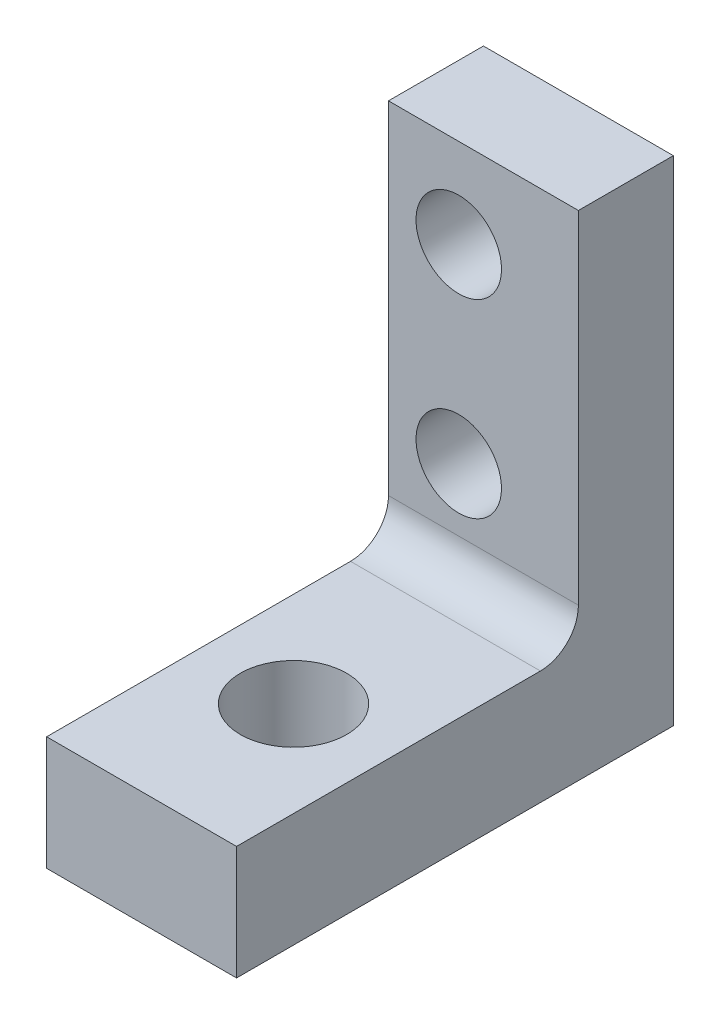
ISO-10303-21;
HEADER;
FILE_DESCRIPTION(('STEP AP214'),'2;1');
FILE_NAME('part.step','',(''),(''),'','','');
FILE_SCHEMA(('AUTOMOTIVE_DESIGN { 1 0 10303 214 1 1 1 1 }'));
ENDSEC;
DATA;
#1=APPLICATION_CONTEXT('core data for automotive mechanical design processes');
#2=APPLICATION_PROTOCOL_DEFINITION('international standard','automotive_design',2000,#1);
#3=PRODUCT_CONTEXT('',#1,'mechanical');
#4=PRODUCT('Part','Part','',(#3));
#5=PRODUCT_RELATED_PRODUCT_CATEGORY('part','',(#4));
#6=PRODUCT_DEFINITION_FORMATION('','',#4);
#7=PRODUCT_DEFINITION_CONTEXT('part definition',#1,'design');
#8=PRODUCT_DEFINITION('design','',#6,#7);
#9=PRODUCT_DEFINITION_SHAPE('','',#8);
#10=(LENGTH_UNIT() NAMED_UNIT(*) SI_UNIT(.MILLI.,.METRE.));
#11=(NAMED_UNIT(*) PLANE_ANGLE_UNIT() SI_UNIT($,.RADIAN.));
#12=(NAMED_UNIT(*) SI_UNIT($,.STERADIAN.) SOLID_ANGLE_UNIT());
#13=UNCERTAINTY_MEASURE_WITH_UNIT(LENGTH_MEASURE(1.E-05),#10,'distance_accuracy_value','');
#14=(GEOMETRIC_REPRESENTATION_CONTEXT(3) GLOBAL_UNCERTAINTY_ASSIGNED_CONTEXT((#13)) GLOBAL_UNIT_ASSIGNED_CONTEXT((#10,
#11,#12)) REPRESENTATION_CONTEXT('',''));
#15=CARTESIAN_POINT('',(0.,0.,0.));
#16=DIRECTION('',(0.,0.,1.));
#17=DIRECTION('',(1.,0.,0.));
#18=AXIS2_PLACEMENT_3D('',#15,#16,#17);
#19=CARTESIAN_POINT('',(0.,6.,0.));
#20=DIRECTION('',(0.,1.,0.));
#21=DIRECTION('',(0.,0.,1.));
#22=AXIS2_PLACEMENT_3D('',#19,#20,#21);
#23=PLANE('',#22);
#24=DIRECTION('',(0.,0.,-1.));
#25=VECTOR('',#24,1.);
#26=CARTESIAN_POINT('',(5.,6.,8.));
#27=LINE('',#26,#25);
#28=CARTESIAN_POINT('',(5.,6.,8.));
#29=VERTEX_POINT('',#28);
#30=CARTESIAN_POINT('',(5.,6.,-8.));
#31=VERTEX_POINT('',#30);
#32=EDGE_CURVE('E153',#29,#31,#27,.T.);
#33=ORIENTED_EDGE('',*,*,#32,.T.);
#34=DIRECTION('',(1.,0.,0.));
#35=VECTOR('',#34,1.);
#36=CARTESIAN_POINT('',(0.,6.,-8.));
#37=LINE('',#36,#35);
#38=CARTESIAN_POINT('',(-5.,6.,-8.));
#39=VERTEX_POINT('',#38);
#40=EDGE_CURVE('E75',#31,#39,#37,.F.);
#41=ORIENTED_EDGE('',*,*,#40,.T.);
#42=DIRECTION('',(0.,0.,1.));
#43=VECTOR('',#42,1.);
#44=CARTESIAN_POINT('',(-5.,6.,-15.));
#45=LINE('',#44,#43);
#46=CARTESIAN_POINT('',(-5.,6.,8.));
#47=VERTEX_POINT('',#46);
#48=EDGE_CURVE('E148',#39,#47,#45,.T.);
#49=ORIENTED_EDGE('',*,*,#48,.T.);
#50=DIRECTION('',(1.,0.,0.));
#51=VECTOR('',#50,1.);
#52=CARTESIAN_POINT('',(-5.,6.,8.));
#53=LINE('',#52,#51);
#54=EDGE_CURVE('E150',#47,#29,#53,.T.);
#55=ORIENTED_EDGE('',*,*,#54,.T.);
#56=EDGE_LOOP('',(#33,#41,#49,#55));
#57=FACE_BOUND('',#56,.T.);
#58=CARTESIAN_POINT('',(0.,6.,0.));
#59=DIRECTION('',(0.,1.,0.));
#60=DIRECTION('',(0.,0.,1.));
#61=AXIS2_PLACEMENT_3D('',#58,#59,#60);
#62=CIRCLE('',#61,2.8);
#63=CARTESIAN_POINT('',(0.,6.,2.8));
#64=VERTEX_POINT('',#63);
#65=EDGE_CURVE('E140',#64,#64,#62,.T.);
#66=ORIENTED_EDGE('',*,*,#65,.F.);
#67=EDGE_LOOP('',(#66));
#68=FACE_BOUND('',#67,.T.);
#69=ADVANCED_FACE('F54',(#57,#68),#23,.T.);
#70=CARTESIAN_POINT('',(0.,0.,0.));
#71=DIRECTION('',(0.,1.,0.));
#72=DIRECTION('',(0.,0.,1.));
#73=AXIS2_PLACEMENT_3D('',#70,#71,#72);
#74=PLANE('',#73);
#75=DIRECTION('',(-1.,0.,0.));
#76=VECTOR('',#75,1.);
#77=CARTESIAN_POINT('',(5.,0.,-15.));
#78=LINE('',#77,#76);
#79=CARTESIAN_POINT('',(5.,0.,-15.));
#80=VERTEX_POINT('',#79);
#81=CARTESIAN_POINT('',(-5.,0.,-15.));
#82=VERTEX_POINT('',#81);
#83=EDGE_CURVE('E146',#80,#82,#78,.T.);
#84=ORIENTED_EDGE('',*,*,#83,.F.);
#85=DIRECTION('',(0.,0.,-1.));
#86=VECTOR('',#85,1.);
#87=CARTESIAN_POINT('',(5.,0.,8.));
#88=LINE('',#87,#86);
#89=CARTESIAN_POINT('',(5.,0.,8.));
#90=VERTEX_POINT('',#89);
#91=EDGE_CURVE('E151',#90,#80,#88,.T.);
#92=ORIENTED_EDGE('',*,*,#91,.F.);
#93=DIRECTION('',(1.,0.,0.));
#94=VECTOR('',#93,1.);
#95=CARTESIAN_POINT('',(-5.,0.,8.));
#96=LINE('',#95,#94);
#97=CARTESIAN_POINT('',(-5.,0.,8.));
#98=VERTEX_POINT('',#97);
#99=EDGE_CURVE('E160',#98,#90,#96,.T.);
#100=ORIENTED_EDGE('',*,*,#99,.F.);
#101=DIRECTION('',(0.,0.,1.));
#102=VECTOR('',#101,1.);
#103=CARTESIAN_POINT('',(-5.,0.,-15.));
#104=LINE('',#103,#102);
#105=EDGE_CURVE('E158',#82,#98,#104,.T.);
#106=ORIENTED_EDGE('',*,*,#105,.F.);
#107=EDGE_LOOP('',(#84,#92,#100,#106));
#108=FACE_BOUND('',#107,.T.);
#109=CARTESIAN_POINT('',(0.,0.,0.));
#110=DIRECTION('',(0.,1.,0.));
#111=DIRECTION('',(0.,0.,1.));
#112=AXIS2_PLACEMENT_3D('',#109,#110,#111);
#113=CIRCLE('',#112,2.8);
#114=CARTESIAN_POINT('',(0.,0.,2.8));
#115=VERTEX_POINT('',#114);
#116=EDGE_CURVE('E137',#115,#115,#113,.T.);
#117=ORIENTED_EDGE('',*,*,#116,.T.);
#118=EDGE_LOOP('',(#117));
#119=FACE_BOUND('',#118,.T.);
#120=ADVANCED_FACE('F209',(#108,#119),#74,.F.);
#121=CARTESIAN_POINT('',(5.,6.,-15.));
#122=DIRECTION('',(0.,0.,1.));
#123=DIRECTION('',(1.,0.,0.));
#124=AXIS2_PLACEMENT_3D('',#121,#122,#123);
#125=PLANE('',#124);
#126=CARTESIAN_POINT('',(-1.3,11.3,-15.));
#127=DIRECTION('',(0.,0.,1.));
#128=DIRECTION('',(1.,0.,0.));
#129=AXIS2_PLACEMENT_3D('',#126,#127,#128);
#130=CIRCLE('',#129,2.25);
#131=CARTESIAN_POINT('',(0.949999999999999,11.3,-15.));
#132=VERTEX_POINT('',#131);
#133=EDGE_CURVE('E133',#132,#132,#130,.T.);
#134=ORIENTED_EDGE('',*,*,#133,.T.);
#135=EDGE_LOOP('',(#134));
#136=FACE_BOUND('',#135,.T.);
#137=CARTESIAN_POINT('',(-1.30000000000004,21.3,-15.));
#138=DIRECTION('',(0.,0.,1.));
#139=DIRECTION('',(1.,0.,0.));
#140=AXIS2_PLACEMENT_3D('',#137,#138,#139);
#141=CIRCLE('',#140,2.25);
#142=CARTESIAN_POINT('',(0.949999999999966,21.3,-15.));
#143=VERTEX_POINT('',#142);
#144=EDGE_CURVE('E181',#143,#143,#141,.T.);
#145=ORIENTED_EDGE('',*,*,#144,.T.);
#146=EDGE_LOOP('',(#145));
#147=FACE_BOUND('',#146,.T.);
#148=ORIENTED_EDGE('',*,*,#83,.T.);
#149=DIRECTION('',(0.,-1.,0.));
#150=VECTOR('',#149,1.);
#151=CARTESIAN_POINT('',(-5.,6.,-15.));
#152=LINE('',#151,#150);
#153=CARTESIAN_POINT('',(-5.,26.,-15.));
#154=VERTEX_POINT('',#153);
#155=EDGE_CURVE('E171',#154,#82,#152,.T.);
#156=ORIENTED_EDGE('',*,*,#155,.F.);
#157=DIRECTION('',(-1.,0.,0.));
#158=VECTOR('',#157,1.);
#159=CARTESIAN_POINT('',(-5.,26.,-15.));
#160=LINE('',#159,#158);
#161=CARTESIAN_POINT('',(5.,26.,-15.));
#162=VERTEX_POINT('',#161);
#163=EDGE_CURVE('E130',#162,#154,#160,.T.);
#164=ORIENTED_EDGE('',*,*,#163,.F.);
#165=DIRECTION('',(0.,-1.,0.));
#166=VECTOR('',#165,1.);
#167=CARTESIAN_POINT('',(5.,6.,-15.));
#168=LINE('',#167,#166);
#169=EDGE_CURVE('E155',#162,#80,#168,.T.);
#170=ORIENTED_EDGE('',*,*,#169,.T.);
#171=EDGE_LOOP('',(#148,#156,#164,#170));
#172=FACE_BOUND('',#171,.T.);
#173=ADVANCED_FACE('F206',(#136,#147,#172),#125,.F.);
#174=CARTESIAN_POINT('',(-5.,6.,-15.));
#175=DIRECTION('',(1.,0.,0.));
#176=DIRECTION('',(0.,0.,-1.));
#177=AXIS2_PLACEMENT_3D('',#174,#175,#176);
#178=PLANE('',#177);
#179=ORIENTED_EDGE('',*,*,#105,.T.);
#180=DIRECTION('',(0.,-1.,0.));
#181=VECTOR('',#180,1.);
#182=CARTESIAN_POINT('',(-5.,6.,8.));
#183=LINE('',#182,#181);
#184=EDGE_CURVE('E168',#47,#98,#183,.T.);
#185=ORIENTED_EDGE('',*,*,#184,.F.);
#186=ORIENTED_EDGE('',*,*,#48,.F.);
#187=CARTESIAN_POINT('',(-5.,8.,-8.));
#188=DIRECTION('',(1.,0.,0.));
#189=DIRECTION('',(0.,0.,-1.));
#190=AXIS2_PLACEMENT_3D('',#187,#188,#189);
#191=CIRCLE('',#190,2.);
#192=CARTESIAN_POINT('',(-5.,8.,-10.));
#193=VERTEX_POINT('',#192);
#194=EDGE_CURVE('E12',#39,#193,#191,.T.);
#195=ORIENTED_EDGE('',*,*,#194,.T.);
#196=DIRECTION('',(0.,-1.,0.));
#197=VECTOR('',#196,1.);
#198=CARTESIAN_POINT('',(-5.,26.,-10.));
#199=LINE('',#198,#197);
#200=CARTESIAN_POINT('',(-5.,26.,-10.));
#201=VERTEX_POINT('',#200);
#202=EDGE_CURVE('E117',#201,#193,#199,.T.);
#203=ORIENTED_EDGE('',*,*,#202,.F.);
#204=DIRECTION('',(0.,0.,1.));
#205=VECTOR('',#204,1.);
#206=CARTESIAN_POINT('',(-5.,26.,-10.));
#207=LINE('',#206,#205);
#208=EDGE_CURVE('E124',#154,#201,#207,.T.);
#209=ORIENTED_EDGE('',*,*,#208,.F.);
#210=ORIENTED_EDGE('',*,*,#155,.T.);
#211=EDGE_LOOP('',(#179,#185,#186,#195,#203,#209,#210));
#212=FACE_BOUND('',#211,.T.);
#213=ADVANCED_FACE('F135',(#212),#178,.F.);
#214=CARTESIAN_POINT('',(-5.,6.,8.));
#215=DIRECTION('',(0.,0.,-1.));
#216=DIRECTION('',(-1.,0.,0.));
#217=AXIS2_PLACEMENT_3D('',#214,#215,#216);
#218=PLANE('',#217);
#219=ORIENTED_EDGE('',*,*,#99,.T.);
#220=DIRECTION('',(0.,-1.,0.));
#221=VECTOR('',#220,1.);
#222=CARTESIAN_POINT('',(5.,6.,8.));
#223=LINE('',#222,#221);
#224=EDGE_CURVE('E165',#29,#90,#223,.T.);
#225=ORIENTED_EDGE('',*,*,#224,.F.);
#226=ORIENTED_EDGE('',*,*,#54,.F.);
#227=ORIENTED_EDGE('',*,*,#184,.T.);
#228=EDGE_LOOP('',(#219,#225,#226,#227));
#229=FACE_BOUND('',#228,.T.);
#230=ADVANCED_FACE('F219',(#229),#218,.F.);
#231=CARTESIAN_POINT('',(5.,6.,8.));
#232=DIRECTION('',(-1.,0.,0.));
#233=DIRECTION('',(0.,0.,1.));
#234=AXIS2_PLACEMENT_3D('',#231,#232,#233);
#235=PLANE('',#234);
#236=ORIENTED_EDGE('',*,*,#91,.T.);
#237=ORIENTED_EDGE('',*,*,#169,.F.);
#238=DIRECTION('',(0.,0.,-1.));
#239=VECTOR('',#238,1.);
#240=CARTESIAN_POINT('',(5.,26.,-15.));
#241=LINE('',#240,#239);
#242=CARTESIAN_POINT('',(5.,26.,-10.));
#243=VERTEX_POINT('',#242);
#244=EDGE_CURVE('E123',#243,#162,#241,.T.);
#245=ORIENTED_EDGE('',*,*,#244,.F.);
#246=DIRECTION('',(0.,-1.,0.));
#247=VECTOR('',#246,1.);
#248=CARTESIAN_POINT('',(5.,26.,-10.));
#249=LINE('',#248,#247);
#250=CARTESIAN_POINT('',(5.,8.,-10.));
#251=VERTEX_POINT('',#250);
#252=EDGE_CURVE('E119',#243,#251,#249,.T.);
#253=ORIENTED_EDGE('',*,*,#252,.T.);
#254=CARTESIAN_POINT('',(5.,8.,-8.));
#255=DIRECTION('',(-1.,0.,0.));
#256=DIRECTION('',(0.,0.,1.));
#257=AXIS2_PLACEMENT_3D('',#254,#255,#256);
#258=CIRCLE('',#257,2.);
#259=EDGE_CURVE('E62',#251,#31,#258,.T.);
#260=ORIENTED_EDGE('',*,*,#259,.T.);
#261=ORIENTED_EDGE('',*,*,#32,.F.);
#262=ORIENTED_EDGE('',*,*,#224,.T.);
#263=EDGE_LOOP('',(#236,#237,#245,#253,#260,#261,#262));
#264=FACE_BOUND('',#263,.T.);
#265=ADVANCED_FACE('F176',(#264),#235,.F.);
#266=CARTESIAN_POINT('',(0.,6.,0.));
#267=DIRECTION('',(0.,-1.,0.));
#268=DIRECTION('',(0.,0.,-1.));
#269=AXIS2_PLACEMENT_3D('',#266,#267,#268);
#270=CYLINDRICAL_SURFACE('',#269,2.8);
#271=ORIENTED_EDGE('',*,*,#65,.T.);
#272=EDGE_LOOP('',(#271));
#273=FACE_BOUND('',#272,.T.);
#274=ORIENTED_EDGE('',*,*,#116,.F.);
#275=EDGE_LOOP('',(#274));
#276=FACE_BOUND('',#275,.T.);
#277=ADVANCED_FACE('F196',(#273,#276),#270,.F.);
#278=CARTESIAN_POINT('',(5.,26.,-10.));
#279=DIRECTION('',(0.,0.,-1.));
#280=DIRECTION('',(-1.,0.,0.));
#281=AXIS2_PLACEMENT_3D('',#278,#279,#280);
#282=PLANE('',#281);
#283=CARTESIAN_POINT('',(-1.3,11.3,-10.));
#284=DIRECTION('',(0.,0.,1.));
#285=DIRECTION('',(1.,0.,0.));
#286=AXIS2_PLACEMENT_3D('',#283,#284,#285);
#287=CIRCLE('',#286,2.25);
#288=CARTESIAN_POINT('',(0.949999999999999,11.3,-10.));
#289=VERTEX_POINT('',#288);
#290=EDGE_CURVE('E184',#289,#289,#287,.T.);
#291=ORIENTED_EDGE('',*,*,#290,.F.);
#292=EDGE_LOOP('',(#291));
#293=FACE_BOUND('',#292,.T.);
#294=CARTESIAN_POINT('',(-1.30000000000004,21.3,-10.));
#295=DIRECTION('',(0.,0.,1.));
#296=DIRECTION('',(1.,0.,0.));
#297=AXIS2_PLACEMENT_3D('',#294,#295,#296);
#298=CIRCLE('',#297,2.25);
#299=CARTESIAN_POINT('',(0.949999999999966,21.3,-10.));
#300=VERTEX_POINT('',#299);
#301=EDGE_CURVE('E185',#300,#300,#298,.T.);
#302=ORIENTED_EDGE('',*,*,#301,.F.);
#303=EDGE_LOOP('',(#302));
#304=FACE_BOUND('',#303,.T.);
#305=ORIENTED_EDGE('',*,*,#202,.T.);
#306=DIRECTION('',(1.,0.,0.));
#307=VECTOR('',#306,1.);
#308=CARTESIAN_POINT('',(5.,8.,-10.));
#309=LINE('',#308,#307);
#310=EDGE_CURVE('E173',#193,#251,#309,.T.);
#311=ORIENTED_EDGE('',*,*,#310,.T.);
#312=ORIENTED_EDGE('',*,*,#252,.F.);
#313=DIRECTION('',(1.,0.,0.));
#314=VECTOR('',#313,1.);
#315=CARTESIAN_POINT('',(5.,26.,-10.));
#316=LINE('',#315,#314);
#317=EDGE_CURVE('E112',#201,#243,#316,.T.);
#318=ORIENTED_EDGE('',*,*,#317,.F.);
#319=EDGE_LOOP('',(#305,#311,#312,#318));
#320=FACE_BOUND('',#319,.T.);
#321=ADVANCED_FACE('F114',(#293,#304,#320),#282,.F.);
#322=CARTESIAN_POINT('',(0.,26.,0.));
#323=DIRECTION('',(0.,-1.,0.));
#324=DIRECTION('',(0.,0.,-1.));
#325=AXIS2_PLACEMENT_3D('',#322,#323,#324);
#326=PLANE('',#325);
#327=ORIENTED_EDGE('',*,*,#208,.T.);
#328=ORIENTED_EDGE('',*,*,#317,.T.);
#329=ORIENTED_EDGE('',*,*,#244,.T.);
#330=ORIENTED_EDGE('',*,*,#163,.T.);
#331=EDGE_LOOP('',(#327,#328,#329,#330));
#332=FACE_BOUND('',#331,.T.);
#333=ADVANCED_FACE('F128',(#332),#326,.F.);
#334=CARTESIAN_POINT('',(-1.30000000000004,21.3,-20.));
#335=DIRECTION('',(0.,0.,1.));
#336=DIRECTION('',(1.,0.,0.));
#337=AXIS2_PLACEMENT_3D('',#334,#335,#336);
#338=CYLINDRICAL_SURFACE('',#337,2.25);
#339=ORIENTED_EDGE('',*,*,#301,.T.);
#340=EDGE_LOOP('',(#339));
#341=FACE_BOUND('',#340,.T.);
#342=ORIENTED_EDGE('',*,*,#144,.F.);
#343=EDGE_LOOP('',(#342));
#344=FACE_BOUND('',#343,.T.);
#345=ADVANCED_FACE('F200',(#341,#344),#338,.F.);
#346=CARTESIAN_POINT('',(-1.3,11.3,-20.));
#347=DIRECTION('',(0.,0.,1.));
#348=DIRECTION('',(1.,0.,0.));
#349=AXIS2_PLACEMENT_3D('',#346,#347,#348);
#350=CYLINDRICAL_SURFACE('',#349,2.25);
#351=ORIENTED_EDGE('',*,*,#290,.T.);
#352=EDGE_LOOP('',(#351));
#353=FACE_BOUND('',#352,.T.);
#354=ORIENTED_EDGE('',*,*,#133,.F.);
#355=EDGE_LOOP('',(#354));
#356=FACE_BOUND('',#355,.T.);
#357=ADVANCED_FACE('F191',(#353,#356),#350,.F.);
#358=CARTESIAN_POINT('',(5.,8.,-8.));
#359=DIRECTION('',(1.,0.,0.));
#360=DIRECTION('',(0.,0.,-1.));
#361=AXIS2_PLACEMENT_3D('',#358,#359,#360);
#362=CYLINDRICAL_SURFACE('',#361,2.);
#363=ORIENTED_EDGE('',*,*,#194,.F.);
#364=ORIENTED_EDGE('',*,*,#40,.F.);
#365=ORIENTED_EDGE('',*,*,#259,.F.);
#366=ORIENTED_EDGE('',*,*,#310,.F.);
#367=EDGE_LOOP('',(#363,#364,#365,#366));
#368=FACE_BOUND('',#367,.T.);
#369=ADVANCED_FACE('F56',(#368),#362,.F.);
#370=CLOSED_SHELL('',(#69,#120,#173,#213,#230,#265,#277,#321,#333,#345,#357,#369));
#371=MANIFOLD_SOLID_BREP('B2',#370);
#372=ADVANCED_BREP_SHAPE_REPRESENTATION('',(#18,#371),#14);
#373=SHAPE_DEFINITION_REPRESENTATION(#9,#372);
ENDSEC;
END-ISO-10303-21;
